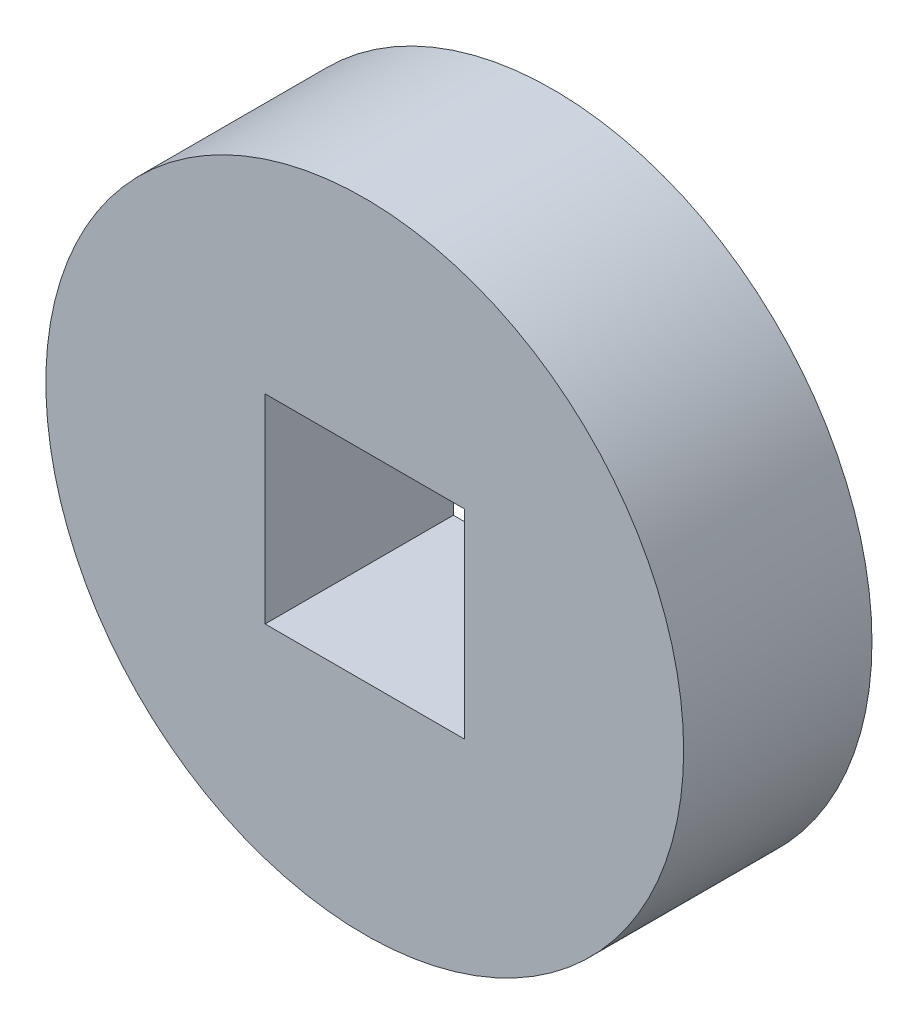
ISO-10303-21;
HEADER;
FILE_DESCRIPTION(('STEP AP214'),'2;1');
FILE_NAME('part.step','',(''),(''),'','','');
FILE_SCHEMA(('AUTOMOTIVE_DESIGN { 1 0 10303 214 1 1 1 1 }'));
ENDSEC;
DATA;
#1=APPLICATION_CONTEXT('core data for automotive mechanical design processes');
#2=APPLICATION_PROTOCOL_DEFINITION('international standard','automotive_design',2000,#1);
#3=PRODUCT_CONTEXT('',#1,'mechanical');
#4=PRODUCT('Part','Part','',(#3));
#5=PRODUCT_RELATED_PRODUCT_CATEGORY('part','',(#4));
#6=PRODUCT_DEFINITION_FORMATION('','',#4);
#7=PRODUCT_DEFINITION_CONTEXT('part definition',#1,'design');
#8=PRODUCT_DEFINITION('design','',#6,#7);
#9=PRODUCT_DEFINITION_SHAPE('','',#8);
#10=(LENGTH_UNIT() NAMED_UNIT(*) SI_UNIT(.MILLI.,.METRE.));
#11=(NAMED_UNIT(*) PLANE_ANGLE_UNIT() SI_UNIT($,.RADIAN.));
#12=(NAMED_UNIT(*) SI_UNIT($,.STERADIAN.) SOLID_ANGLE_UNIT());
#13=UNCERTAINTY_MEASURE_WITH_UNIT(LENGTH_MEASURE(1.E-05),#10,'distance_accuracy_value','');
#14=(GEOMETRIC_REPRESENTATION_CONTEXT(3) GLOBAL_UNCERTAINTY_ASSIGNED_CONTEXT((#13)) GLOBAL_UNIT_ASSIGNED_CONTEXT((#10,
#11,#12)) REPRESENTATION_CONTEXT('',''));
#15=CARTESIAN_POINT('',(0.,0.,0.));
#16=DIRECTION('',(0.,0.,1.));
#17=DIRECTION('',(1.,0.,0.));
#18=AXIS2_PLACEMENT_3D('',#15,#16,#17);
#19=CARTESIAN_POINT('',(0.,0.,3.));
#20=DIRECTION('',(0.,0.,1.));
#21=DIRECTION('',(1.,0.,0.));
#22=AXIS2_PLACEMENT_3D('',#19,#20,#21);
#23=PLANE('',#22);
#24=CARTESIAN_POINT('',(0.,0.,3.));
#25=DIRECTION('',(0.,0.,1.));
#26=DIRECTION('',(1.,0.,0.));
#27=AXIS2_PLACEMENT_3D('',#24,#25,#26);
#28=CIRCLE('',#27,5.08);
#29=CARTESIAN_POINT('',(5.08,0.,3.));
#30=VERTEX_POINT('',#29);
#31=EDGE_CURVE('E11',#30,#30,#28,.T.);
#32=ORIENTED_EDGE('',*,*,#31,.T.);
#33=EDGE_LOOP('',(#32));
#34=FACE_BOUND('',#33,.T.);
#35=DIRECTION('',(-1.,0.,0.));
#36=VECTOR('',#35,1.);
#37=CARTESIAN_POINT('',(-1.5875,1.5875,3.));
#38=LINE('',#37,#36);
#39=CARTESIAN_POINT('',(1.5875,1.5875,3.));
#40=VERTEX_POINT('',#39);
#41=CARTESIAN_POINT('',(-1.5875,1.5875,3.));
#42=VERTEX_POINT('',#41);
#43=EDGE_CURVE('E82',#40,#42,#38,.T.);
#44=ORIENTED_EDGE('',*,*,#43,.F.);
#45=DIRECTION('',(0.,1.,0.));
#46=VECTOR('',#45,1.);
#47=CARTESIAN_POINT('',(1.5875,1.5875,3.));
#48=LINE('',#47,#46);
#49=CARTESIAN_POINT('',(1.5875,-1.5875,3.));
#50=VERTEX_POINT('',#49);
#51=EDGE_CURVE('E74',#50,#40,#48,.T.);
#52=ORIENTED_EDGE('',*,*,#51,.F.);
#53=DIRECTION('',(1.,0.,0.));
#54=VECTOR('',#53,1.);
#55=CARTESIAN_POINT('',(-1.5875,-1.5875,3.));
#56=LINE('',#55,#54);
#57=CARTESIAN_POINT('',(-1.5875,-1.5875,3.));
#58=VERTEX_POINT('',#57);
#59=EDGE_CURVE('E95',#58,#50,#56,.T.);
#60=ORIENTED_EDGE('',*,*,#59,.F.);
#61=DIRECTION('',(0.,-1.,0.));
#62=VECTOR('',#61,1.);
#63=CARTESIAN_POINT('',(-1.5875,1.5875,3.));
#64=LINE('',#63,#62);
#65=EDGE_CURVE('E93',#42,#58,#64,.T.);
#66=ORIENTED_EDGE('',*,*,#65,.F.);
#67=EDGE_LOOP('',(#44,#52,#60,#66));
#68=FACE_BOUND('',#67,.T.);
#69=ADVANCED_FACE('F33',(#34,#68),#23,.T.);
#70=CARTESIAN_POINT('',(0.,0.,0.));
#71=DIRECTION('',(0.,0.,1.));
#72=DIRECTION('',(1.,0.,0.));
#73=AXIS2_PLACEMENT_3D('',#70,#71,#72);
#74=PLANE('',#73);
#75=CARTESIAN_POINT('',(0.,0.,0.));
#76=DIRECTION('',(0.,0.,1.));
#77=DIRECTION('',(1.,0.,0.));
#78=AXIS2_PLACEMENT_3D('',#75,#76,#77);
#79=CIRCLE('',#78,5.08);
#80=CARTESIAN_POINT('',(5.08,0.,0.));
#81=VERTEX_POINT('',#80);
#82=EDGE_CURVE('E37',#81,#81,#79,.T.);
#83=ORIENTED_EDGE('',*,*,#82,.F.);
#84=EDGE_LOOP('',(#83));
#85=FACE_BOUND('',#84,.T.);
#86=DIRECTION('',(0.,1.,0.));
#87=VECTOR('',#86,1.);
#88=CARTESIAN_POINT('',(1.5875,1.5875,0.));
#89=LINE('',#88,#87);
#90=CARTESIAN_POINT('',(1.5875,-1.5875,0.));
#91=VERTEX_POINT('',#90);
#92=CARTESIAN_POINT('',(1.5875,1.5875,0.));
#93=VERTEX_POINT('',#92);
#94=EDGE_CURVE('E56',#91,#93,#89,.T.);
#95=ORIENTED_EDGE('',*,*,#94,.T.);
#96=DIRECTION('',(-1.,0.,0.));
#97=VECTOR('',#96,1.);
#98=CARTESIAN_POINT('',(-1.5875,1.5875,0.));
#99=LINE('',#98,#97);
#100=CARTESIAN_POINT('',(-1.5875,1.5875,0.));
#101=VERTEX_POINT('',#100);
#102=EDGE_CURVE('E89',#93,#101,#99,.T.);
#103=ORIENTED_EDGE('',*,*,#102,.T.);
#104=DIRECTION('',(0.,-1.,0.));
#105=VECTOR('',#104,1.);
#106=CARTESIAN_POINT('',(-1.5875,1.5875,0.));
#107=LINE('',#106,#105);
#108=CARTESIAN_POINT('',(-1.5875,-1.5875,0.));
#109=VERTEX_POINT('',#108);
#110=EDGE_CURVE('E101',#101,#109,#107,.T.);
#111=ORIENTED_EDGE('',*,*,#110,.T.);
#112=DIRECTION('',(1.,0.,0.));
#113=VECTOR('',#112,1.);
#114=CARTESIAN_POINT('',(-1.5875,-1.5875,0.));
#115=LINE('',#114,#113);
#116=EDGE_CURVE('E83',#109,#91,#115,.T.);
#117=ORIENTED_EDGE('',*,*,#116,.T.);
#118=EDGE_LOOP('',(#95,#103,#111,#117));
#119=FACE_BOUND('',#118,.T.);
#120=ADVANCED_FACE('F112',(#85,#119),#74,.F.);
#121=CARTESIAN_POINT('',(0.,0.,3.));
#122=DIRECTION('',(0.,0.,-1.));
#123=DIRECTION('',(-1.,0.,0.));
#124=AXIS2_PLACEMENT_3D('',#121,#122,#123);
#125=CYLINDRICAL_SURFACE('',#124,5.08);
#126=ORIENTED_EDGE('',*,*,#31,.F.);
#127=EDGE_LOOP('',(#126));
#128=FACE_BOUND('',#127,.T.);
#129=ORIENTED_EDGE('',*,*,#82,.T.);
#130=EDGE_LOOP('',(#129));
#131=FACE_BOUND('',#130,.T.);
#132=ADVANCED_FACE('F35',(#128,#131),#125,.T.);
#133=CARTESIAN_POINT('',(1.5875,1.5875,3.));
#134=DIRECTION('',(-1.,0.,0.));
#135=DIRECTION('',(0.,-1.,0.));
#136=AXIS2_PLACEMENT_3D('',#133,#134,#135);
#137=PLANE('',#136);
#138=ORIENTED_EDGE('',*,*,#94,.F.);
#139=DIRECTION('',(0.,0.,-1.));
#140=VECTOR('',#139,1.);
#141=CARTESIAN_POINT('',(1.5875,-1.5875,3.));
#142=LINE('',#141,#140);
#143=EDGE_CURVE('E78',#50,#91,#142,.T.);
#144=ORIENTED_EDGE('',*,*,#143,.F.);
#145=ORIENTED_EDGE('',*,*,#51,.T.);
#146=DIRECTION('',(0.,0.,-1.));
#147=VECTOR('',#146,1.);
#148=CARTESIAN_POINT('',(1.5875,1.5875,3.));
#149=LINE('',#148,#147);
#150=EDGE_CURVE('E77',#40,#93,#149,.T.);
#151=ORIENTED_EDGE('',*,*,#150,.T.);
#152=EDGE_LOOP('',(#138,#144,#145,#151));
#153=FACE_BOUND('',#152,.T.);
#154=ADVANCED_FACE('F76',(#153),#137,.T.);
#155=CARTESIAN_POINT('',(-1.5875,1.5875,3.));
#156=DIRECTION('',(0.,-1.,0.));
#157=DIRECTION('',(0.,0.,-1.));
#158=AXIS2_PLACEMENT_3D('',#155,#156,#157);
#159=PLANE('',#158);
#160=ORIENTED_EDGE('',*,*,#102,.F.);
#161=ORIENTED_EDGE('',*,*,#150,.F.);
#162=ORIENTED_EDGE('',*,*,#43,.T.);
#163=DIRECTION('',(0.,0.,-1.));
#164=VECTOR('',#163,1.);
#165=CARTESIAN_POINT('',(-1.5875,1.5875,3.));
#166=LINE('',#165,#164);
#167=EDGE_CURVE('E90',#42,#101,#166,.T.);
#168=ORIENTED_EDGE('',*,*,#167,.T.);
#169=EDGE_LOOP('',(#160,#161,#162,#168));
#170=FACE_BOUND('',#169,.T.);
#171=ADVANCED_FACE('F86',(#170),#159,.T.);
#172=CARTESIAN_POINT('',(-1.5875,1.5875,3.));
#173=DIRECTION('',(1.,0.,0.));
#174=DIRECTION('',(0.,1.,0.));
#175=AXIS2_PLACEMENT_3D('',#172,#173,#174);
#176=PLANE('',#175);
#177=ORIENTED_EDGE('',*,*,#110,.F.);
#178=ORIENTED_EDGE('',*,*,#167,.F.);
#179=ORIENTED_EDGE('',*,*,#65,.T.);
#180=DIRECTION('',(0.,0.,-1.));
#181=VECTOR('',#180,1.);
#182=CARTESIAN_POINT('',(-1.5875,-1.5875,3.));
#183=LINE('',#182,#181);
#184=EDGE_CURVE('E48',#58,#109,#183,.T.);
#185=ORIENTED_EDGE('',*,*,#184,.T.);
#186=EDGE_LOOP('',(#177,#178,#179,#185));
#187=FACE_BOUND('',#186,.T.);
#188=ADVANCED_FACE('F110',(#187),#176,.T.);
#189=CARTESIAN_POINT('',(-1.5875,-1.5875,3.));
#190=DIRECTION('',(0.,1.,0.));
#191=DIRECTION('',(0.,0.,1.));
#192=AXIS2_PLACEMENT_3D('',#189,#190,#191);
#193=PLANE('',#192);
#194=ORIENTED_EDGE('',*,*,#116,.F.);
#195=ORIENTED_EDGE('',*,*,#184,.F.);
#196=ORIENTED_EDGE('',*,*,#59,.T.);
#197=ORIENTED_EDGE('',*,*,#143,.T.);
#198=EDGE_LOOP('',(#194,#195,#196,#197));
#199=FACE_BOUND('',#198,.T.);
#200=ADVANCED_FACE('F113',(#199),#193,.T.);
#201=CLOSED_SHELL('',(#69,#120,#132,#154,#171,#188,#200));
#202=MANIFOLD_SOLID_BREP('B2',#201);
#203=ADVANCED_BREP_SHAPE_REPRESENTATION('',(#18,#202),#14);
#204=SHAPE_DEFINITION_REPRESENTATION(#9,#203);
ENDSEC;
END-ISO-10303-21;
